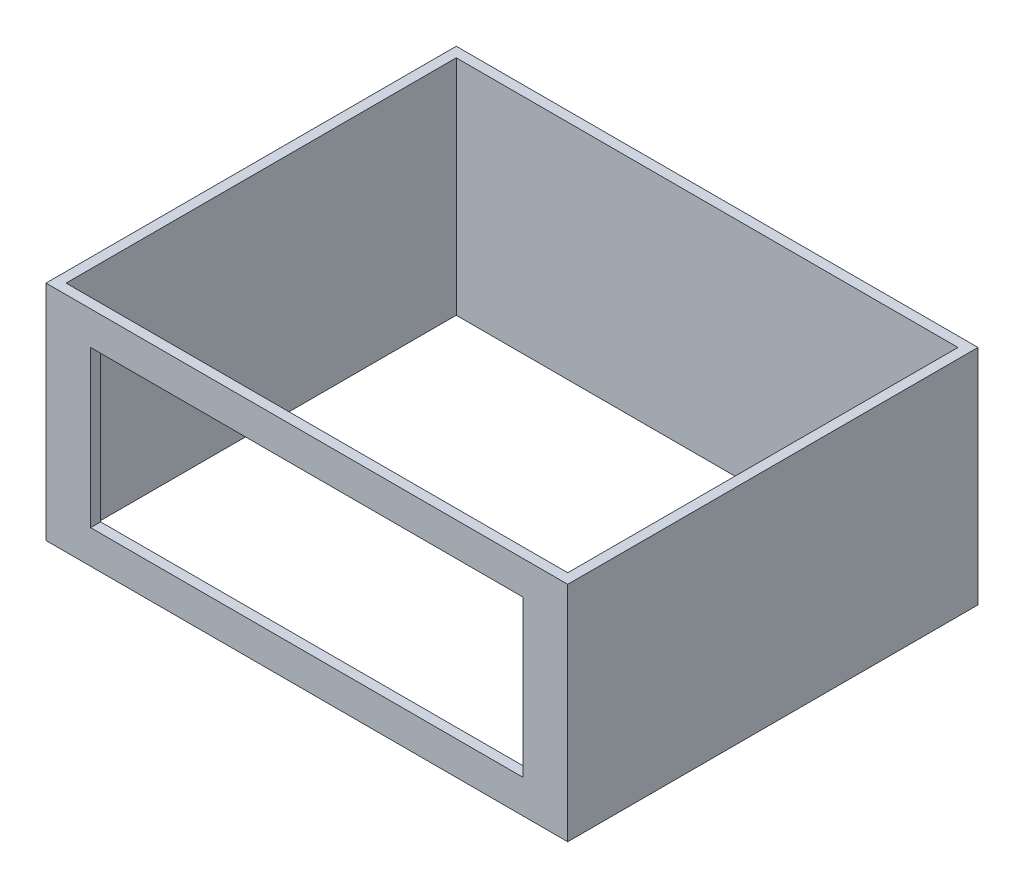
ISO-10303-21;
HEADER;
FILE_DESCRIPTION(('STEP AP214'),'2;1');
FILE_NAME('part.step','',(''),(''),'','','');
FILE_SCHEMA(('AUTOMOTIVE_DESIGN { 1 0 10303 214 1 1 1 1 }'));
ENDSEC;
DATA;
#1=APPLICATION_CONTEXT('core data for automotive mechanical design processes');
#2=APPLICATION_PROTOCOL_DEFINITION('international standard','automotive_design',2000,#1);
#3=PRODUCT_CONTEXT('',#1,'mechanical');
#4=PRODUCT('Part','Part','',(#3));
#5=PRODUCT_RELATED_PRODUCT_CATEGORY('part','',(#4));
#6=PRODUCT_DEFINITION_FORMATION('','',#4);
#7=PRODUCT_DEFINITION_CONTEXT('part definition',#1,'design');
#8=PRODUCT_DEFINITION('design','',#6,#7);
#9=PRODUCT_DEFINITION_SHAPE('','',#8);
#10=(LENGTH_UNIT() NAMED_UNIT(*) SI_UNIT(.MILLI.,.METRE.));
#11=(NAMED_UNIT(*) PLANE_ANGLE_UNIT() SI_UNIT($,.RADIAN.));
#12=(NAMED_UNIT(*) SI_UNIT($,.STERADIAN.) SOLID_ANGLE_UNIT());
#13=UNCERTAINTY_MEASURE_WITH_UNIT(LENGTH_MEASURE(1.E-05),#10,'distance_accuracy_value','');
#14=(GEOMETRIC_REPRESENTATION_CONTEXT(3) GLOBAL_UNCERTAINTY_ASSIGNED_CONTEXT((#13)) GLOBAL_UNIT_ASSIGNED_CONTEXT((#10,
#11,#12)) REPRESENTATION_CONTEXT('',''));
#15=CARTESIAN_POINT('',(0.,0.,0.));
#16=DIRECTION('',(0.,0.,1.));
#17=DIRECTION('',(1.,0.,0.));
#18=AXIS2_PLACEMENT_3D('',#15,#16,#17);
#19=CARTESIAN_POINT('',(5.07692307692319,400.,718.));
#20=DIRECTION('',(0.,0.,-1.));
#21=DIRECTION('',(-1.,0.,0.));
#22=AXIS2_PLACEMENT_3D('',#19,#20,#21);
#23=PLANE('',#22);
#24=DIRECTION('',(1.,0.,0.));
#25=VECTOR('',#24,1.);
#26=CARTESIAN_POINT('',(5.07692307692319,0.,718.));
#27=LINE('',#26,#25);
#28=CARTESIAN_POINT('',(5.07692307692319,0.,718.));
#29=VERTEX_POINT('',#28);
#30=CARTESIAN_POINT('',(941.076923076923,0.,718.));
#31=VERTEX_POINT('',#30);
#32=EDGE_CURVE('E197',#29,#31,#27,.T.);
#33=ORIENTED_EDGE('',*,*,#32,.T.);
#34=DIRECTION('',(0.,-1.,0.));
#35=VECTOR('',#34,1.);
#36=CARTESIAN_POINT('',(941.076923076923,400.,718.));
#37=LINE('',#36,#35);
#38=CARTESIAN_POINT('',(941.076923076923,400.,718.));
#39=VERTEX_POINT('',#38);
#40=EDGE_CURVE('E202',#39,#31,#37,.T.);
#41=ORIENTED_EDGE('',*,*,#40,.F.);
#42=DIRECTION('',(1.,0.,0.));
#43=VECTOR('',#42,1.);
#44=CARTESIAN_POINT('',(5.07692307692319,400.,718.));
#45=LINE('',#44,#43);
#46=CARTESIAN_POINT('',(5.07692307692319,400.,718.));
#47=VERTEX_POINT('',#46);
#48=EDGE_CURVE('E188',#47,#39,#45,.T.);
#49=ORIENTED_EDGE('',*,*,#48,.F.);
#50=DIRECTION('',(0.,-1.,0.));
#51=VECTOR('',#50,1.);
#52=CARTESIAN_POINT('',(5.07692307692319,400.,718.));
#53=LINE('',#52,#51);
#54=EDGE_CURVE('E205',#47,#29,#53,.T.);
#55=ORIENTED_EDGE('',*,*,#54,.T.);
#56=EDGE_LOOP('',(#33,#41,#49,#55));
#57=FACE_BOUND('',#56,.T.);
#58=DIRECTION('',(0.,1.,0.));
#59=VECTOR('',#58,1.);
#60=CARTESIAN_POINT('',(85.0769230769232,0.,718.));
#61=LINE('',#60,#59);
#62=CARTESIAN_POINT('',(85.0769230769232,59.9999999999999,718.));
#63=VERTEX_POINT('',#62);
#64=CARTESIAN_POINT('',(85.0769230769232,340.,718.));
#65=VERTEX_POINT('',#64);
#66=EDGE_CURVE('E50',#63,#65,#61,.T.);
#67=ORIENTED_EDGE('',*,*,#66,.T.);
#68=DIRECTION('',(-1.,0.,0.));
#69=VECTOR('',#68,1.);
#70=CARTESIAN_POINT('',(0.,340.,718.));
#71=LINE('',#70,#69);
#72=CARTESIAN_POINT('',(861.076923076923,340.,718.));
#73=VERTEX_POINT('',#72);
#74=EDGE_CURVE('E141',#73,#65,#71,.T.);
#75=ORIENTED_EDGE('',*,*,#74,.F.);
#76=DIRECTION('',(0.,1.,0.));
#77=VECTOR('',#76,1.);
#78=CARTESIAN_POINT('',(861.076923076923,0.,718.));
#79=LINE('',#78,#77);
#80=CARTESIAN_POINT('',(861.076923076923,60.,718.));
#81=VERTEX_POINT('',#80);
#82=EDGE_CURVE('E127',#81,#73,#79,.T.);
#83=ORIENTED_EDGE('',*,*,#82,.F.);
#84=DIRECTION('',(-1.,0.,0.));
#85=VECTOR('',#84,1.);
#86=CARTESIAN_POINT('',(0.,59.9999999999999,718.));
#87=LINE('',#86,#85);
#88=EDGE_CURVE('E136',#81,#63,#87,.T.);
#89=ORIENTED_EDGE('',*,*,#88,.T.);
#90=EDGE_LOOP('',(#67,#75,#83,#89));
#91=FACE_BOUND('',#90,.T.);
#92=ADVANCED_FACE('F35',(#57,#91),#23,.F.);
#93=CARTESIAN_POINT('',(23.0769230769232,400.,700.));
#94=DIRECTION('',(0.,0.,-1.));
#95=DIRECTION('',(-1.,0.,0.));
#96=AXIS2_PLACEMENT_3D('',#93,#94,#95);
#97=PLANE('',#96);
#98=DIRECTION('',(1.,0.,0.));
#99=VECTOR('',#98,1.);
#100=CARTESIAN_POINT('',(23.0769230769232,0.,700.));
#101=LINE('',#100,#99);
#102=CARTESIAN_POINT('',(23.0769230769232,0.,700.));
#103=VERTEX_POINT('',#102);
#104=CARTESIAN_POINT('',(923.076923076923,0.,700.));
#105=VERTEX_POINT('',#104);
#106=EDGE_CURVE('E164',#103,#105,#101,.T.);
#107=ORIENTED_EDGE('',*,*,#106,.F.);
#108=DIRECTION('',(0.,-1.,0.));
#109=VECTOR('',#108,1.);
#110=CARTESIAN_POINT('',(23.0769230769232,400.,700.));
#111=LINE('',#110,#109);
#112=CARTESIAN_POINT('',(23.0769230769232,400.,700.));
#113=VERTEX_POINT('',#112);
#114=EDGE_CURVE('E178',#113,#103,#111,.T.);
#115=ORIENTED_EDGE('',*,*,#114,.F.);
#116=DIRECTION('',(1.,0.,0.));
#117=VECTOR('',#116,1.);
#118=CARTESIAN_POINT('',(23.0769230769232,400.,700.));
#119=LINE('',#118,#117);
#120=CARTESIAN_POINT('',(923.076923076923,400.,700.));
#121=VERTEX_POINT('',#120);
#122=EDGE_CURVE('E153',#113,#121,#119,.T.);
#123=ORIENTED_EDGE('',*,*,#122,.T.);
#124=DIRECTION('',(0.,-1.,0.));
#125=VECTOR('',#124,1.);
#126=CARTESIAN_POINT('',(923.076923076923,400.,700.));
#127=LINE('',#126,#125);
#128=EDGE_CURVE('E176',#121,#105,#127,.T.);
#129=ORIENTED_EDGE('',*,*,#128,.T.);
#130=EDGE_LOOP('',(#107,#115,#123,#129));
#131=FACE_BOUND('',#130,.T.);
#132=DIRECTION('',(1.,0.,0.));
#133=VECTOR('',#132,1.);
#134=CARTESIAN_POINT('',(23.0769230769232,340.,700.));
#135=LINE('',#134,#133);
#136=CARTESIAN_POINT('',(85.0769230769232,340.,700.));
#137=VERTEX_POINT('',#136);
#138=CARTESIAN_POINT('',(861.076923076923,340.,700.));
#139=VERTEX_POINT('',#138);
#140=EDGE_CURVE('E43',#137,#139,#135,.T.);
#141=ORIENTED_EDGE('',*,*,#140,.F.);
#142=DIRECTION('',(0.,-1.,0.));
#143=VECTOR('',#142,1.);
#144=CARTESIAN_POINT('',(85.0769230769232,400.,700.));
#145=LINE('',#144,#143);
#146=CARTESIAN_POINT('',(85.0769230769232,59.9999999999999,700.));
#147=VERTEX_POINT('',#146);
#148=EDGE_CURVE('E11',#137,#147,#145,.T.);
#149=ORIENTED_EDGE('',*,*,#148,.T.);
#150=DIRECTION('',(1.,0.,0.));
#151=VECTOR('',#150,1.);
#152=CARTESIAN_POINT('',(23.0769230769232,59.9999999999999,700.));
#153=LINE('',#152,#151);
#154=CARTESIAN_POINT('',(861.076923076923,60.,700.));
#155=VERTEX_POINT('',#154);
#156=EDGE_CURVE('E211',#147,#155,#153,.T.);
#157=ORIENTED_EDGE('',*,*,#156,.T.);
#158=DIRECTION('',(0.,-1.,0.));
#159=VECTOR('',#158,1.);
#160=CARTESIAN_POINT('',(861.076923076923,400.,700.));
#161=LINE('',#160,#159);
#162=EDGE_CURVE('E130',#139,#155,#161,.T.);
#163=ORIENTED_EDGE('',*,*,#162,.F.);
#164=EDGE_LOOP('',(#141,#149,#157,#163));
#165=FACE_BOUND('',#164,.T.);
#166=ADVANCED_FACE('F218',(#131,#165),#97,.T.);
#167=CARTESIAN_POINT('',(0.,400.,0.));
#168=DIRECTION('',(0.,-1.,0.));
#169=DIRECTION('',(0.,0.,-1.));
#170=AXIS2_PLACEMENT_3D('',#167,#168,#169);
#171=PLANE('',#170);
#172=DIRECTION('',(-1.,0.,0.));
#173=VECTOR('',#172,1.);
#174=CARTESIAN_POINT('',(5.07692307692311,400.,-18.));
#175=LINE('',#174,#173);
#176=CARTESIAN_POINT('',(941.076923076923,400.,-18.));
#177=VERTEX_POINT('',#176);
#178=CARTESIAN_POINT('',(5.07692307692311,400.,-18.));
#179=VERTEX_POINT('',#178);
#180=EDGE_CURVE('E182',#177,#179,#175,.T.);
#181=ORIENTED_EDGE('',*,*,#180,.T.);
#182=DIRECTION('',(0.,0.,1.));
#183=VECTOR('',#182,1.);
#184=CARTESIAN_POINT('',(5.07692307692311,400.,-18.));
#185=LINE('',#184,#183);
#186=EDGE_CURVE('E185',#179,#47,#185,.T.);
#187=ORIENTED_EDGE('',*,*,#186,.T.);
#188=ORIENTED_EDGE('',*,*,#48,.T.);
#189=DIRECTION('',(0.,0.,-1.));
#190=VECTOR('',#189,1.);
#191=CARTESIAN_POINT('',(941.076923076923,400.,-18.));
#192=LINE('',#191,#190);
#193=EDGE_CURVE('E190',#39,#177,#192,.T.);
#194=ORIENTED_EDGE('',*,*,#193,.T.);
#195=EDGE_LOOP('',(#181,#187,#188,#194));
#196=FACE_BOUND('',#195,.T.);
#197=DIRECTION('',(0.,0.,1.));
#198=VECTOR('',#197,1.);
#199=CARTESIAN_POINT('',(23.0769230769231,400.,0.));
#200=LINE('',#199,#198);
#201=CARTESIAN_POINT('',(23.0769230769231,400.,0.));
#202=VERTEX_POINT('',#201);
#203=EDGE_CURVE('E151',#202,#113,#200,.T.);
#204=ORIENTED_EDGE('',*,*,#203,.F.);
#205=DIRECTION('',(-1.,0.,0.));
#206=VECTOR('',#205,1.);
#207=CARTESIAN_POINT('',(23.0769230769231,400.,0.));
#208=LINE('',#207,#206);
#209=CARTESIAN_POINT('',(923.076923076923,400.,0.));
#210=VERTEX_POINT('',#209);
#211=EDGE_CURVE('E159',#210,#202,#208,.T.);
#212=ORIENTED_EDGE('',*,*,#211,.F.);
#213=DIRECTION('',(0.,0.,-1.));
#214=VECTOR('',#213,1.);
#215=CARTESIAN_POINT('',(923.076923076923,400.,0.));
#216=LINE('',#215,#214);
#217=EDGE_CURVE('E156',#121,#210,#216,.T.);
#218=ORIENTED_EDGE('',*,*,#217,.F.);
#219=ORIENTED_EDGE('',*,*,#122,.F.);
#220=EDGE_LOOP('',(#204,#212,#218,#219));
#221=FACE_BOUND('',#220,.T.);
#222=ADVANCED_FACE('F238',(#196,#221),#171,.F.);
#223=CARTESIAN_POINT('',(0.,0.,0.));
#224=DIRECTION('',(0.,-1.,0.));
#225=DIRECTION('',(0.,0.,-1.));
#226=AXIS2_PLACEMENT_3D('',#223,#224,#225);
#227=PLANE('',#226);
#228=DIRECTION('',(-1.,0.,0.));
#229=VECTOR('',#228,1.);
#230=CARTESIAN_POINT('',(5.07692307692311,0.,-18.));
#231=LINE('',#230,#229);
#232=CARTESIAN_POINT('',(941.076923076923,0.,-18.));
#233=VERTEX_POINT('',#232);
#234=CARTESIAN_POINT('',(5.07692307692311,0.,-18.));
#235=VERTEX_POINT('',#234);
#236=EDGE_CURVE('E181',#233,#235,#231,.T.);
#237=ORIENTED_EDGE('',*,*,#236,.F.);
#238=DIRECTION('',(0.,0.,-1.));
#239=VECTOR('',#238,1.);
#240=CARTESIAN_POINT('',(941.076923076923,0.,-18.));
#241=LINE('',#240,#239);
#242=EDGE_CURVE('E186',#31,#233,#241,.T.);
#243=ORIENTED_EDGE('',*,*,#242,.F.);
#244=ORIENTED_EDGE('',*,*,#32,.F.);
#245=DIRECTION('',(0.,0.,1.));
#246=VECTOR('',#245,1.);
#247=CARTESIAN_POINT('',(5.07692307692311,0.,-18.));
#248=LINE('',#247,#246);
#249=EDGE_CURVE('E195',#235,#29,#248,.T.);
#250=ORIENTED_EDGE('',*,*,#249,.F.);
#251=EDGE_LOOP('',(#237,#243,#244,#250));
#252=FACE_BOUND('',#251,.T.);
#253=DIRECTION('',(-1.,0.,0.));
#254=VECTOR('',#253,1.);
#255=CARTESIAN_POINT('',(23.0769230769231,0.,0.));
#256=LINE('',#255,#254);
#257=CARTESIAN_POINT('',(923.076923076923,0.,0.));
#258=VERTEX_POINT('',#257);
#259=CARTESIAN_POINT('',(23.0769230769231,0.,0.));
#260=VERTEX_POINT('',#259);
#261=EDGE_CURVE('E154',#258,#260,#256,.T.);
#262=ORIENTED_EDGE('',*,*,#261,.T.);
#263=DIRECTION('',(0.,0.,1.));
#264=VECTOR('',#263,1.);
#265=CARTESIAN_POINT('',(23.0769230769231,0.,0.));
#266=LINE('',#265,#264);
#267=EDGE_CURVE('E148',#260,#103,#266,.T.);
#268=ORIENTED_EDGE('',*,*,#267,.T.);
#269=ORIENTED_EDGE('',*,*,#106,.T.);
#270=DIRECTION('',(0.,0.,-1.));
#271=VECTOR('',#270,1.);
#272=CARTESIAN_POINT('',(923.076923076923,0.,0.));
#273=LINE('',#272,#271);
#274=EDGE_CURVE('E167',#105,#258,#273,.T.);
#275=ORIENTED_EDGE('',*,*,#274,.T.);
#276=EDGE_LOOP('',(#262,#268,#269,#275));
#277=FACE_BOUND('',#276,.T.);
#278=ADVANCED_FACE('F253',(#252,#277),#227,.T.);
#279=CARTESIAN_POINT('',(5.07692307692311,400.,-18.));
#280=DIRECTION('',(0.,0.,1.));
#281=DIRECTION('',(1.,0.,0.));
#282=AXIS2_PLACEMENT_3D('',#279,#280,#281);
#283=PLANE('',#282);
#284=ORIENTED_EDGE('',*,*,#236,.T.);
#285=DIRECTION('',(0.,-1.,0.));
#286=VECTOR('',#285,1.);
#287=CARTESIAN_POINT('',(5.07692307692311,400.,-18.));
#288=LINE('',#287,#286);
#289=EDGE_CURVE('E208',#179,#235,#288,.T.);
#290=ORIENTED_EDGE('',*,*,#289,.F.);
#291=ORIENTED_EDGE('',*,*,#180,.F.);
#292=DIRECTION('',(0.,-1.,0.));
#293=VECTOR('',#292,1.);
#294=CARTESIAN_POINT('',(941.076923076923,400.,-18.));
#295=LINE('',#294,#293);
#296=EDGE_CURVE('E192',#177,#233,#295,.T.);
#297=ORIENTED_EDGE('',*,*,#296,.T.);
#298=EDGE_LOOP('',(#284,#290,#291,#297));
#299=FACE_BOUND('',#298,.T.);
#300=ADVANCED_FACE('F37',(#299),#283,.F.);
#301=CARTESIAN_POINT('',(5.07692307692311,400.,-18.));
#302=DIRECTION('',(1.,0.,0.));
#303=DIRECTION('',(0.,0.,-1.));
#304=AXIS2_PLACEMENT_3D('',#301,#302,#303);
#305=PLANE('',#304);
#306=ORIENTED_EDGE('',*,*,#249,.T.);
#307=ORIENTED_EDGE('',*,*,#54,.F.);
#308=ORIENTED_EDGE('',*,*,#186,.F.);
#309=ORIENTED_EDGE('',*,*,#289,.T.);
#310=EDGE_LOOP('',(#306,#307,#308,#309));
#311=FACE_BOUND('',#310,.T.);
#312=ADVANCED_FACE('F244',(#311),#305,.F.);
#313=CARTESIAN_POINT('',(941.076923076923,400.,-18.));
#314=DIRECTION('',(-1.,0.,0.));
#315=DIRECTION('',(0.,0.,1.));
#316=AXIS2_PLACEMENT_3D('',#313,#314,#315);
#317=PLANE('',#316);
#318=ORIENTED_EDGE('',*,*,#242,.T.);
#319=ORIENTED_EDGE('',*,*,#296,.F.);
#320=ORIENTED_EDGE('',*,*,#193,.F.);
#321=ORIENTED_EDGE('',*,*,#40,.T.);
#322=EDGE_LOOP('',(#318,#319,#320,#321));
#323=FACE_BOUND('',#322,.T.);
#324=ADVANCED_FACE('F242',(#323),#317,.F.);
#325=CARTESIAN_POINT('',(23.0769230769231,400.,0.));
#326=DIRECTION('',(1.,0.,0.));
#327=DIRECTION('',(0.,0.,-1.));
#328=AXIS2_PLACEMENT_3D('',#325,#326,#327);
#329=PLANE('',#328);
#330=ORIENTED_EDGE('',*,*,#267,.F.);
#331=DIRECTION('',(0.,-1.,0.));
#332=VECTOR('',#331,1.);
#333=CARTESIAN_POINT('',(23.0769230769231,400.,0.));
#334=LINE('',#333,#332);
#335=EDGE_CURVE('E161',#202,#260,#334,.T.);
#336=ORIENTED_EDGE('',*,*,#335,.F.);
#337=ORIENTED_EDGE('',*,*,#203,.T.);
#338=ORIENTED_EDGE('',*,*,#114,.T.);
#339=EDGE_LOOP('',(#330,#336,#337,#338));
#340=FACE_BOUND('',#339,.T.);
#341=ADVANCED_FACE('F251',(#340),#329,.T.);
#342=CARTESIAN_POINT('',(923.076923076923,400.,0.));
#343=DIRECTION('',(-1.,0.,0.));
#344=DIRECTION('',(0.,0.,1.));
#345=AXIS2_PLACEMENT_3D('',#342,#343,#344);
#346=PLANE('',#345);
#347=ORIENTED_EDGE('',*,*,#274,.F.);
#348=ORIENTED_EDGE('',*,*,#128,.F.);
#349=ORIENTED_EDGE('',*,*,#217,.T.);
#350=DIRECTION('',(0.,-1.,0.));
#351=VECTOR('',#350,1.);
#352=CARTESIAN_POINT('',(923.076923076923,400.,0.));
#353=LINE('',#352,#351);
#354=EDGE_CURVE('E174',#210,#258,#353,.T.);
#355=ORIENTED_EDGE('',*,*,#354,.T.);
#356=EDGE_LOOP('',(#347,#348,#349,#355));
#357=FACE_BOUND('',#356,.T.);
#358=ADVANCED_FACE('F228',(#357),#346,.T.);
#359=CARTESIAN_POINT('',(23.0769230769231,400.,0.));
#360=DIRECTION('',(0.,0.,1.));
#361=DIRECTION('',(1.,0.,0.));
#362=AXIS2_PLACEMENT_3D('',#359,#360,#361);
#363=PLANE('',#362);
#364=ORIENTED_EDGE('',*,*,#261,.F.);
#365=ORIENTED_EDGE('',*,*,#354,.F.);
#366=ORIENTED_EDGE('',*,*,#211,.T.);
#367=ORIENTED_EDGE('',*,*,#335,.T.);
#368=EDGE_LOOP('',(#364,#365,#366,#367));
#369=FACE_BOUND('',#368,.T.);
#370=ADVANCED_FACE('F221',(#369),#363,.T.);
#371=CARTESIAN_POINT('',(85.0769230769232,0.,539.));
#372=DIRECTION('',(1.,0.,0.));
#373=DIRECTION('',(0.,0.,-1.));
#374=AXIS2_PLACEMENT_3D('',#371,#372,#373);
#375=PLANE('',#374);
#376=DIRECTION('',(0.,0.,1.));
#377=VECTOR('',#376,1.);
#378=CARTESIAN_POINT('',(85.0769230769232,340.,539.));
#379=LINE('',#378,#377);
#380=EDGE_CURVE('E146',#137,#65,#379,.T.);
#381=ORIENTED_EDGE('',*,*,#380,.T.);
#382=ORIENTED_EDGE('',*,*,#66,.F.);
#383=DIRECTION('',(0.,0.,1.));
#384=VECTOR('',#383,1.);
#385=CARTESIAN_POINT('',(85.0769230769232,59.9999999999999,539.));
#386=LINE('',#385,#384);
#387=EDGE_CURVE('E133',#147,#63,#386,.T.);
#388=ORIENTED_EDGE('',*,*,#387,.F.);
#389=ORIENTED_EDGE('',*,*,#148,.F.);
#390=EDGE_LOOP('',(#381,#382,#388,#389));
#391=FACE_BOUND('',#390,.T.);
#392=ADVANCED_FACE('F219',(#391),#375,.T.);
#393=CARTESIAN_POINT('',(0.,340.,539.));
#394=DIRECTION('',(0.,1.,0.));
#395=DIRECTION('',(-1.,0.,0.));
#396=AXIS2_PLACEMENT_3D('',#393,#394,#395);
#397=PLANE('',#396);
#398=ORIENTED_EDGE('',*,*,#140,.T.);
#399=DIRECTION('',(0.,0.,1.));
#400=VECTOR('',#399,1.);
#401=CARTESIAN_POINT('',(861.076923076923,340.,539.));
#402=LINE('',#401,#400);
#403=EDGE_CURVE('E132',#139,#73,#402,.T.);
#404=ORIENTED_EDGE('',*,*,#403,.T.);
#405=ORIENTED_EDGE('',*,*,#74,.T.);
#406=ORIENTED_EDGE('',*,*,#380,.F.);
#407=EDGE_LOOP('',(#398,#404,#405,#406));
#408=FACE_BOUND('',#407,.T.);
#409=ADVANCED_FACE('F216',(#408),#397,.F.);
#410=CARTESIAN_POINT('',(861.076923076923,0.,539.));
#411=DIRECTION('',(1.,0.,0.));
#412=DIRECTION('',(0.,0.,-1.));
#413=AXIS2_PLACEMENT_3D('',#410,#411,#412);
#414=PLANE('',#413);
#415=ORIENTED_EDGE('',*,*,#162,.T.);
#416=DIRECTION('',(0.,0.,1.));
#417=VECTOR('',#416,1.);
#418=CARTESIAN_POINT('',(861.076923076923,60.,539.));
#419=LINE('',#418,#417);
#420=EDGE_CURVE('E58',#155,#81,#419,.T.);
#421=ORIENTED_EDGE('',*,*,#420,.T.);
#422=ORIENTED_EDGE('',*,*,#82,.T.);
#423=ORIENTED_EDGE('',*,*,#403,.F.);
#424=EDGE_LOOP('',(#415,#421,#422,#423));
#425=FACE_BOUND('',#424,.T.);
#426=ADVANCED_FACE('F124',(#425),#414,.F.);
#427=CARTESIAN_POINT('',(0.,59.9999999999999,539.));
#428=DIRECTION('',(0.,1.,0.));
#429=DIRECTION('',(-1.,0.,0.));
#430=AXIS2_PLACEMENT_3D('',#427,#428,#429);
#431=PLANE('',#430);
#432=ORIENTED_EDGE('',*,*,#387,.T.);
#433=ORIENTED_EDGE('',*,*,#88,.F.);
#434=ORIENTED_EDGE('',*,*,#420,.F.);
#435=ORIENTED_EDGE('',*,*,#156,.F.);
#436=EDGE_LOOP('',(#432,#433,#434,#435));
#437=FACE_BOUND('',#436,.T.);
#438=ADVANCED_FACE('F137',(#437),#431,.T.);
#439=CLOSED_SHELL('',(#92,#166,#222,#278,#300,#312,#324,#341,#358,#370,#392,#409,#426,#438));
#440=MANIFOLD_SOLID_BREP('B2',#439);
#441=ADVANCED_BREP_SHAPE_REPRESENTATION('',(#18,#440),#14);
#442=SHAPE_DEFINITION_REPRESENTATION(#9,#441);
ENDSEC;
END-ISO-10303-21;
